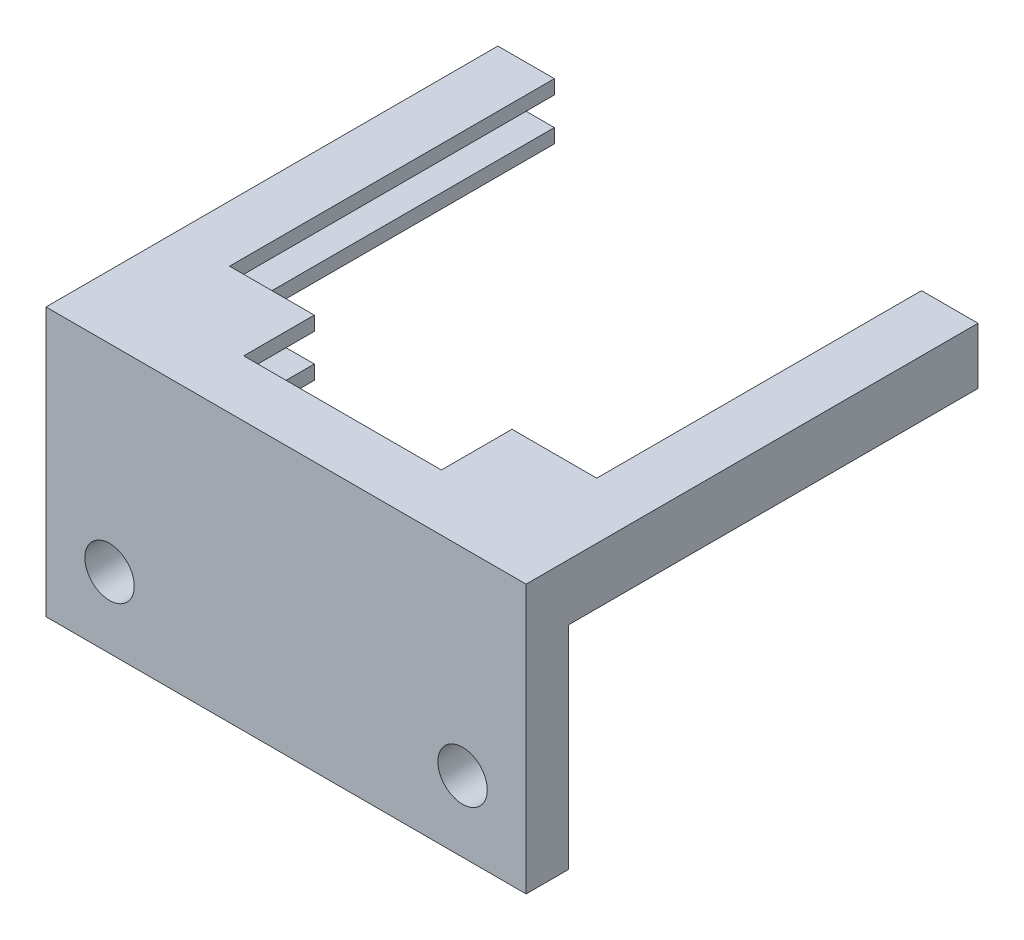
ISO-10303-21;
HEADER;
FILE_DESCRIPTION(('STEP AP214'),'2;1');
FILE_NAME('part.step','',(''),(''),'','','');
FILE_SCHEMA(('AUTOMOTIVE_DESIGN { 1 0 10303 214 1 1 1 1 }'));
ENDSEC;
DATA;
#1=APPLICATION_CONTEXT('core data for automotive mechanical design processes');
#2=APPLICATION_PROTOCOL_DEFINITION('international standard','automotive_design',2000,#1);
#3=PRODUCT_CONTEXT('',#1,'mechanical');
#4=PRODUCT('Part','Part','',(#3));
#5=PRODUCT_RELATED_PRODUCT_CATEGORY('part','',(#4));
#6=PRODUCT_DEFINITION_FORMATION('','',#4);
#7=PRODUCT_DEFINITION_CONTEXT('part definition',#1,'design');
#8=PRODUCT_DEFINITION('design','',#6,#7);
#9=PRODUCT_DEFINITION_SHAPE('','',#8);
#10=(LENGTH_UNIT() NAMED_UNIT(*) SI_UNIT(.MILLI.,.METRE.));
#11=(NAMED_UNIT(*) PLANE_ANGLE_UNIT() SI_UNIT($,.RADIAN.));
#12=(NAMED_UNIT(*) SI_UNIT($,.STERADIAN.) SOLID_ANGLE_UNIT());
#13=UNCERTAINTY_MEASURE_WITH_UNIT(LENGTH_MEASURE(1.E-05),#10,'distance_accuracy_value','');
#14=(GEOMETRIC_REPRESENTATION_CONTEXT(3) GLOBAL_UNCERTAINTY_ASSIGNED_CONTEXT((#13)) GLOBAL_UNIT_ASSIGNED_CONTEXT((#10,
#11,#12)) REPRESENTATION_CONTEXT('',''));
#15=CARTESIAN_POINT('',(0.,0.,0.));
#16=DIRECTION('',(0.,0.,1.));
#17=DIRECTION('',(1.,0.,0.));
#18=AXIS2_PLACEMENT_3D('',#15,#16,#17);
#19=CARTESIAN_POINT('',(4.,0.,-6.));
#20=DIRECTION('',(0.,0.,1.));
#21=DIRECTION('',(1.,0.,0.));
#22=AXIS2_PLACEMENT_3D('',#19,#20,#21);
#23=PLANE('',#22);
#24=DIRECTION('',(0.,-1.,0.));
#25=VECTOR('',#24,1.);
#26=CARTESIAN_POINT('',(10.,4.,-6.));
#27=LINE('',#26,#25);
#28=CARTESIAN_POINT('',(10.,0.999999999999998,-6.));
#29=VERTEX_POINT('',#28);
#30=CARTESIAN_POINT('',(10.,0.,-6.));
#31=VERTEX_POINT('',#30);
#32=EDGE_CURVE('E222',#29,#31,#27,.T.);
#33=ORIENTED_EDGE('',*,*,#32,.T.);
#34=DIRECTION('',(1.,0.,0.));
#35=VECTOR('',#34,1.);
#36=CARTESIAN_POINT('',(4.,0.,-6.));
#37=LINE('',#36,#35);
#38=CARTESIAN_POINT('',(4.,0.,-6.));
#39=VERTEX_POINT('',#38);
#40=EDGE_CURVE('E309',#39,#31,#37,.T.);
#41=ORIENTED_EDGE('',*,*,#40,.F.);
#42=DIRECTION('',(0.,1.,0.));
#43=VECTOR('',#42,1.);
#44=CARTESIAN_POINT('',(4.,0.,-6.));
#45=LINE('',#44,#43);
#46=CARTESIAN_POINT('',(4.,1.,-6.));
#47=VERTEX_POINT('',#46);
#48=EDGE_CURVE('E261',#39,#47,#45,.T.);
#49=ORIENTED_EDGE('',*,*,#48,.T.);
#50=DIRECTION('',(1.,0.,0.));
#51=VECTOR('',#50,1.);
#52=CARTESIAN_POINT('',(4.,1.,-6.));
#53=LINE('',#52,#51);
#54=EDGE_CURVE('E11',#47,#29,#53,.T.);
#55=ORIENTED_EDGE('',*,*,#54,.T.);
#56=EDGE_LOOP('',(#33,#41,#49,#55));
#57=FACE_BOUND('',#56,.T.);
#58=ADVANCED_FACE('F39',(#57),#23,.F.);
#59=CARTESIAN_POINT('',(0.,4.,0.));
#60=DIRECTION('',(0.,-1.,0.));
#61=DIRECTION('',(0.,0.,-1.));
#62=AXIS2_PLACEMENT_3D('',#59,#60,#61);
#63=PLANE('',#62);
#64=DIRECTION('',(0.,0.,-1.));
#65=VECTOR('',#64,1.);
#66=CARTESIAN_POINT('',(10.,4.,13.560219778561));
#67=LINE('',#66,#65);
#68=CARTESIAN_POINT('',(10.,4.,-1.));
#69=VERTEX_POINT('',#68);
#70=CARTESIAN_POINT('',(10.,4.,-6.));
#71=VERTEX_POINT('',#70);
#72=EDGE_CURVE('E214',#69,#71,#67,.T.);
#73=ORIENTED_EDGE('',*,*,#72,.T.);
#74=DIRECTION('',(1.,0.,0.));
#75=VECTOR('',#74,1.);
#76=CARTESIAN_POINT('',(4.,4.,-6.));
#77=LINE('',#76,#75);
#78=CARTESIAN_POINT('',(4.,4.,-6.));
#79=VERTEX_POINT('',#78);
#80=EDGE_CURVE('E228',#79,#71,#77,.T.);
#81=ORIENTED_EDGE('',*,*,#80,.F.);
#82=DIRECTION('',(0.,0.,1.));
#83=VECTOR('',#82,1.);
#84=CARTESIAN_POINT('',(4.,4.,-29.));
#85=LINE('',#84,#83);
#86=CARTESIAN_POINT('',(4.,4.,-29.));
#87=VERTEX_POINT('',#86);
#88=EDGE_CURVE('E244',#87,#79,#85,.T.);
#89=ORIENTED_EDGE('',*,*,#88,.F.);
#90=DIRECTION('',(-1.,0.,0.));
#91=VECTOR('',#90,1.);
#92=CARTESIAN_POINT('',(0.,4.,-29.));
#93=LINE('',#92,#91);
#94=CARTESIAN_POINT('',(0.,4.,-29.));
#95=VERTEX_POINT('',#94);
#96=EDGE_CURVE('E269',#87,#95,#93,.T.);
#97=ORIENTED_EDGE('',*,*,#96,.T.);
#98=DIRECTION('',(0.,0.,1.));
#99=VECTOR('',#98,1.);
#100=CARTESIAN_POINT('',(0.,4.,0.));
#101=LINE('',#100,#99);
#102=CARTESIAN_POINT('',(0.,4.,3.));
#103=VERTEX_POINT('',#102);
#104=EDGE_CURVE('E264',#95,#103,#101,.T.);
#105=ORIENTED_EDGE('',*,*,#104,.T.);
#106=DIRECTION('',(-1.,0.,0.));
#107=VECTOR('',#106,1.);
#108=CARTESIAN_POINT('',(53.2353840616714,4.,3.));
#109=LINE('',#108,#107);
#110=CARTESIAN_POINT('',(34.,4.,3.));
#111=VERTEX_POINT('',#110);
#112=EDGE_CURVE('E371',#111,#103,#109,.T.);
#113=ORIENTED_EDGE('',*,*,#112,.F.);
#114=DIRECTION('',(0.,0.,-1.));
#115=VECTOR('',#114,1.);
#116=CARTESIAN_POINT('',(34.,4.,0.));
#117=LINE('',#116,#115);
#118=CARTESIAN_POINT('',(34.,4.,-29.));
#119=VERTEX_POINT('',#118);
#120=EDGE_CURVE('E266',#111,#119,#117,.T.);
#121=ORIENTED_EDGE('',*,*,#120,.T.);
#122=CARTESIAN_POINT('',(30.,4.,-29.));
#123=VERTEX_POINT('',#122);
#124=EDGE_CURVE('E270',#119,#123,#93,.T.);
#125=ORIENTED_EDGE('',*,*,#124,.T.);
#126=DIRECTION('',(0.,0.,-1.));
#127=VECTOR('',#126,1.);
#128=CARTESIAN_POINT('',(30.,4.,-29.));
#129=LINE('',#128,#127);
#130=CARTESIAN_POINT('',(30.,4.,-6.));
#131=VERTEX_POINT('',#130);
#132=EDGE_CURVE('E238',#131,#123,#129,.T.);
#133=ORIENTED_EDGE('',*,*,#132,.F.);
#134=CARTESIAN_POINT('',(24.,4.,-6.));
#135=VERTEX_POINT('',#134);
#136=EDGE_CURVE('E239',#135,#131,#77,.T.);
#137=ORIENTED_EDGE('',*,*,#136,.F.);
#138=DIRECTION('',(0.,0.,-1.));
#139=VECTOR('',#138,1.);
#140=CARTESIAN_POINT('',(24.,4.,13.560219778561));
#141=LINE('',#140,#139);
#142=CARTESIAN_POINT('',(24.,4.,-1.));
#143=VERTEX_POINT('',#142);
#144=EDGE_CURVE('E411',#143,#135,#141,.T.);
#145=ORIENTED_EDGE('',*,*,#144,.F.);
#146=DIRECTION('',(1.,0.,0.));
#147=VECTOR('',#146,1.);
#148=CARTESIAN_POINT('',(24.,4.,-1.));
#149=LINE('',#148,#147);
#150=EDGE_CURVE('E230',#69,#143,#149,.T.);
#151=ORIENTED_EDGE('',*,*,#150,.F.);
#152=EDGE_LOOP('',(#73,#81,#89,#97,#105,#113,#121,#125,#133,#137,#145,#151));
#153=FACE_BOUND('',#152,.T.);
#154=ADVANCED_FACE('F226',(#153),#63,.F.);
#155=CARTESIAN_POINT('',(0.,0.,0.));
#156=DIRECTION('',(0.,-1.,0.));
#157=DIRECTION('',(0.,0.,-1.));
#158=AXIS2_PLACEMENT_3D('',#155,#156,#157);
#159=PLANE('',#158);
#160=ORIENTED_EDGE('',*,*,#40,.T.);
#161=DIRECTION('',(0.,0.,-1.));
#162=VECTOR('',#161,1.);
#163=CARTESIAN_POINT('',(10.,0.,13.560219778561));
#164=LINE('',#163,#162);
#165=CARTESIAN_POINT('',(10.,0.,-1.));
#166=VERTEX_POINT('',#165);
#167=EDGE_CURVE('E232',#166,#31,#164,.T.);
#168=ORIENTED_EDGE('',*,*,#167,.F.);
#169=DIRECTION('',(1.,0.,0.));
#170=VECTOR('',#169,1.);
#171=CARTESIAN_POINT('',(24.,0.,-1.));
#172=LINE('',#171,#170);
#173=CARTESIAN_POINT('',(24.,0.,-1.));
#174=VERTEX_POINT('',#173);
#175=EDGE_CURVE('E231',#166,#174,#172,.T.);
#176=ORIENTED_EDGE('',*,*,#175,.T.);
#177=DIRECTION('',(0.,0.,-1.));
#178=VECTOR('',#177,1.);
#179=CARTESIAN_POINT('',(24.,0.,13.560219778561));
#180=LINE('',#179,#178);
#181=CARTESIAN_POINT('',(24.,0.,-6.));
#182=VERTEX_POINT('',#181);
#183=EDGE_CURVE('E408',#174,#182,#180,.T.);
#184=ORIENTED_EDGE('',*,*,#183,.T.);
#185=CARTESIAN_POINT('',(30.,0.,-6.));
#186=VERTEX_POINT('',#185);
#187=EDGE_CURVE('E314',#182,#186,#37,.T.);
#188=ORIENTED_EDGE('',*,*,#187,.T.);
#189=DIRECTION('',(0.,0.,-1.));
#190=VECTOR('',#189,1.);
#191=CARTESIAN_POINT('',(30.,0.,-29.));
#192=LINE('',#191,#190);
#193=CARTESIAN_POINT('',(30.,0.,-29.));
#194=VERTEX_POINT('',#193);
#195=EDGE_CURVE('E307',#186,#194,#192,.T.);
#196=ORIENTED_EDGE('',*,*,#195,.T.);
#197=DIRECTION('',(-1.,0.,0.));
#198=VECTOR('',#197,1.);
#199=CARTESIAN_POINT('',(0.,0.,-29.));
#200=LINE('',#199,#198);
#201=CARTESIAN_POINT('',(34.,0.,-29.));
#202=VERTEX_POINT('',#201);
#203=EDGE_CURVE('E267',#202,#194,#200,.T.);
#204=ORIENTED_EDGE('',*,*,#203,.F.);
#205=DIRECTION('',(0.,0.,-1.));
#206=VECTOR('',#205,1.);
#207=CARTESIAN_POINT('',(34.,0.,0.));
#208=LINE('',#207,#206);
#209=CARTESIAN_POINT('',(34.,0.,0.));
#210=VERTEX_POINT('',#209);
#211=EDGE_CURVE('E279',#210,#202,#208,.T.);
#212=ORIENTED_EDGE('',*,*,#211,.F.);
#213=DIRECTION('',(1.,0.,0.));
#214=VECTOR('',#213,1.);
#215=CARTESIAN_POINT('',(0.,0.,0.));
#216=LINE('',#215,#214);
#217=CARTESIAN_POINT('',(0.,0.,0.));
#218=VERTEX_POINT('',#217);
#219=EDGE_CURVE('E276',#218,#210,#216,.T.);
#220=ORIENTED_EDGE('',*,*,#219,.F.);
#221=DIRECTION('',(0.,0.,1.));
#222=VECTOR('',#221,1.);
#223=CARTESIAN_POINT('',(0.,0.,0.));
#224=LINE('',#223,#222);
#225=CARTESIAN_POINT('',(0.,0.,-29.));
#226=VERTEX_POINT('',#225);
#227=EDGE_CURVE('E251',#226,#218,#224,.T.);
#228=ORIENTED_EDGE('',*,*,#227,.F.);
#229=CARTESIAN_POINT('',(4.,0.,-29.));
#230=VERTEX_POINT('',#229);
#231=EDGE_CURVE('E281',#230,#226,#200,.T.);
#232=ORIENTED_EDGE('',*,*,#231,.F.);
#233=DIRECTION('',(0.,0.,1.));
#234=VECTOR('',#233,1.);
#235=CARTESIAN_POINT('',(4.,0.,-29.));
#236=LINE('',#235,#234);
#237=EDGE_CURVE('E242',#230,#39,#236,.T.);
#238=ORIENTED_EDGE('',*,*,#237,.T.);
#239=EDGE_LOOP('',(#160,#168,#176,#184,#188,#196,#204,#212,#220,#228,#232,#238));
#240=FACE_BOUND('',#239,.T.);
#241=ADVANCED_FACE('F481',(#240),#159,.T.);
#242=CARTESIAN_POINT('',(10.,3.,-6.));
#243=VERTEX_POINT('',#242);
#244=EDGE_CURVE('E211',#71,#243,#27,.T.);
#245=ORIENTED_EDGE('',*,*,#244,.T.);
#246=DIRECTION('',(-1.,0.,0.));
#247=VECTOR('',#246,1.);
#248=CARTESIAN_POINT('',(4.,3.,-6.));
#249=LINE('',#248,#247);
#250=CARTESIAN_POINT('',(4.,3.,-6.));
#251=VERTEX_POINT('',#250);
#252=EDGE_CURVE('E288',#243,#251,#249,.T.);
#253=ORIENTED_EDGE('',*,*,#252,.T.);
#254=EDGE_CURVE('E236',#251,#79,#45,.T.);
#255=ORIENTED_EDGE('',*,*,#254,.T.);
#256=ORIENTED_EDGE('',*,*,#80,.T.);
#257=EDGE_LOOP('',(#245,#253,#255,#256));
#258=FACE_BOUND('',#257,.T.);
#259=ADVANCED_FACE('F234',(#258),#23,.F.);
#260=CARTESIAN_POINT('',(1.,1.,-1.));
#261=DIRECTION('',(0.,-1.,0.));
#262=DIRECTION('',(1.,0.,0.));
#263=AXIS2_PLACEMENT_3D('',#260,#261,#262);
#264=PLANE('',#263);
#265=DIRECTION('',(0.,0.,1.));
#266=VECTOR('',#265,1.);
#267=CARTESIAN_POINT('',(10.,0.999999999999999,-1.));
#268=LINE('',#267,#266);
#269=CARTESIAN_POINT('',(10.,0.999999999999999,-1.));
#270=VERTEX_POINT('',#269);
#271=EDGE_CURVE('E389',#29,#270,#268,.T.);
#272=ORIENTED_EDGE('',*,*,#271,.F.);
#273=ORIENTED_EDGE('',*,*,#54,.F.);
#274=DIRECTION('',(0.,0.,1.));
#275=VECTOR('',#274,1.);
#276=CARTESIAN_POINT('',(4.,1.,-29.));
#277=LINE('',#276,#275);
#278=CARTESIAN_POINT('',(4.,1.,-29.));
#279=VERTEX_POINT('',#278);
#280=EDGE_CURVE('E319',#279,#47,#277,.T.);
#281=ORIENTED_EDGE('',*,*,#280,.F.);
#282=DIRECTION('',(-1.,0.,0.));
#283=VECTOR('',#282,1.);
#284=CARTESIAN_POINT('',(1.,1.,-29.));
#285=LINE('',#284,#283);
#286=CARTESIAN_POINT('',(1.,1.,-29.));
#287=VERTEX_POINT('',#286);
#288=EDGE_CURVE('E340',#279,#287,#285,.T.);
#289=ORIENTED_EDGE('',*,*,#288,.T.);
#290=DIRECTION('',(0.,0.,-1.));
#291=VECTOR('',#290,1.);
#292=CARTESIAN_POINT('',(1.,1.,-1.));
#293=LINE('',#292,#291);
#294=CARTESIAN_POINT('',(1.,1.,-1.));
#295=VERTEX_POINT('',#294);
#296=EDGE_CURVE('E326',#295,#287,#293,.T.);
#297=ORIENTED_EDGE('',*,*,#296,.F.);
#298=DIRECTION('',(-1.,0.,0.));
#299=VECTOR('',#298,1.);
#300=CARTESIAN_POINT('',(1.,1.,-1.));
#301=LINE('',#300,#299);
#302=EDGE_CURVE('E352',#270,#295,#301,.T.);
#303=ORIENTED_EDGE('',*,*,#302,.F.);
#304=EDGE_LOOP('',(#272,#273,#281,#289,#297,#303));
#305=FACE_BOUND('',#304,.T.);
#306=ADVANCED_FACE('F517',(#305),#264,.F.);
#307=CARTESIAN_POINT('',(1.,3.,-1.));
#308=DIRECTION('',(0.,1.,0.));
#309=DIRECTION('',(-1.,0.,0.));
#310=AXIS2_PLACEMENT_3D('',#307,#308,#309);
#311=PLANE('',#310);
#312=DIRECTION('',(0.,0.,-1.));
#313=VECTOR('',#312,1.);
#314=CARTESIAN_POINT('',(10.,3.,-1.));
#315=LINE('',#314,#313);
#316=CARTESIAN_POINT('',(10.,3.,-1.));
#317=VERTEX_POINT('',#316);
#318=EDGE_CURVE('E217',#317,#243,#315,.T.);
#319=ORIENTED_EDGE('',*,*,#318,.F.);
#320=DIRECTION('',(1.,0.,0.));
#321=VECTOR('',#320,1.);
#322=CARTESIAN_POINT('',(1.,3.,-1.));
#323=LINE('',#322,#321);
#324=CARTESIAN_POINT('',(1.,3.,-1.));
#325=VERTEX_POINT('',#324);
#326=EDGE_CURVE('E356',#325,#317,#323,.T.);
#327=ORIENTED_EDGE('',*,*,#326,.F.);
#328=DIRECTION('',(0.,0.,-1.));
#329=VECTOR('',#328,1.);
#330=CARTESIAN_POINT('',(1.,3.,-1.));
#331=LINE('',#330,#329);
#332=CARTESIAN_POINT('',(1.,3.,-29.));
#333=VERTEX_POINT('',#332);
#334=EDGE_CURVE('E327',#325,#333,#331,.T.);
#335=ORIENTED_EDGE('',*,*,#334,.T.);
#336=DIRECTION('',(1.,0.,0.));
#337=VECTOR('',#336,1.);
#338=CARTESIAN_POINT('',(1.,3.,-29.));
#339=LINE('',#338,#337);
#340=CARTESIAN_POINT('',(4.,3.,-29.));
#341=VERTEX_POINT('',#340);
#342=EDGE_CURVE('E300',#333,#341,#339,.T.);
#343=ORIENTED_EDGE('',*,*,#342,.T.);
#344=DIRECTION('',(0.,0.,-1.));
#345=VECTOR('',#344,1.);
#346=CARTESIAN_POINT('',(4.,3.,-29.));
#347=LINE('',#346,#345);
#348=EDGE_CURVE('E297',#251,#341,#347,.T.);
#349=ORIENTED_EDGE('',*,*,#348,.F.);
#350=ORIENTED_EDGE('',*,*,#252,.F.);
#351=EDGE_LOOP('',(#319,#327,#335,#343,#349,#350));
#352=FACE_BOUND('',#351,.T.);
#353=ADVANCED_FACE('F298',(#352),#311,.F.);
#354=CARTESIAN_POINT('',(4.,0.,-29.));
#355=DIRECTION('',(-1.,0.,0.));
#356=DIRECTION('',(0.,0.,1.));
#357=AXIS2_PLACEMENT_3D('',#354,#355,#356);
#358=PLANE('',#357);
#359=DIRECTION('',(0.,1.,0.));
#360=VECTOR('',#359,1.);
#361=CARTESIAN_POINT('',(4.,0.,-29.));
#362=LINE('',#361,#360);
#363=EDGE_CURVE('E248',#230,#279,#362,.T.);
#364=ORIENTED_EDGE('',*,*,#363,.T.);
#365=ORIENTED_EDGE('',*,*,#280,.T.);
#366=ORIENTED_EDGE('',*,*,#48,.F.);
#367=ORIENTED_EDGE('',*,*,#237,.F.);
#368=EDGE_LOOP('',(#364,#365,#366,#367));
#369=FACE_BOUND('',#368,.T.);
#370=ADVANCED_FACE('F531',(#369),#358,.F.);
#371=CARTESIAN_POINT('',(30.,0.,-29.));
#372=DIRECTION('',(1.,0.,0.));
#373=DIRECTION('',(0.,0.,-1.));
#374=AXIS2_PLACEMENT_3D('',#371,#372,#373);
#375=PLANE('',#374);
#376=DIRECTION('',(0.,1.,0.));
#377=VECTOR('',#376,1.);
#378=CARTESIAN_POINT('',(30.,0.,-6.));
#379=LINE('',#378,#377);
#380=CARTESIAN_POINT('',(30.,0.999999999999996,-6.));
#381=VERTEX_POINT('',#380);
#382=EDGE_CURVE('E257',#186,#381,#379,.T.);
#383=ORIENTED_EDGE('',*,*,#382,.T.);
#384=DIRECTION('',(0.,0.,-1.));
#385=VECTOR('',#384,1.);
#386=CARTESIAN_POINT('',(30.,0.999999999999997,-29.));
#387=LINE('',#386,#385);
#388=CARTESIAN_POINT('',(30.,0.999999999999997,-29.));
#389=VERTEX_POINT('',#388);
#390=EDGE_CURVE('E303',#381,#389,#387,.T.);
#391=ORIENTED_EDGE('',*,*,#390,.T.);
#392=DIRECTION('',(0.,1.,0.));
#393=VECTOR('',#392,1.);
#394=CARTESIAN_POINT('',(30.,0.,-29.));
#395=LINE('',#394,#393);
#396=EDGE_CURVE('E253',#194,#389,#395,.T.);
#397=ORIENTED_EDGE('',*,*,#396,.F.);
#398=ORIENTED_EDGE('',*,*,#195,.F.);
#399=EDGE_LOOP('',(#383,#391,#397,#398));
#400=FACE_BOUND('',#399,.T.);
#401=ADVANCED_FACE('F483',(#400),#375,.F.);
#402=ORIENTED_EDGE('',*,*,#187,.F.);
#403=DIRECTION('',(0.,-1.,0.));
#404=VECTOR('',#403,1.);
#405=CARTESIAN_POINT('',(24.,4.,-6.));
#406=LINE('',#405,#404);
#407=CARTESIAN_POINT('',(24.,0.999999999999998,-6.));
#408=VERTEX_POINT('',#407);
#409=EDGE_CURVE('E221',#408,#182,#406,.T.);
#410=ORIENTED_EDGE('',*,*,#409,.F.);
#411=EDGE_CURVE('E47',#408,#381,#53,.T.);
#412=ORIENTED_EDGE('',*,*,#411,.T.);
#413=ORIENTED_EDGE('',*,*,#382,.F.);
#414=EDGE_LOOP('',(#402,#410,#412,#413));
#415=FACE_BOUND('',#414,.T.);
#416=ADVANCED_FACE('F479',(#415),#23,.F.);
#417=CARTESIAN_POINT('',(0.,4.,-29.));
#418=DIRECTION('',(0.,0.,1.));
#419=DIRECTION('',(1.,0.,0.));
#420=AXIS2_PLACEMENT_3D('',#417,#418,#419);
#421=PLANE('',#420);
#422=DIRECTION('',(0.,1.,0.));
#423=VECTOR('',#422,1.);
#424=CARTESIAN_POINT('',(1.,1.,-29.));
#425=LINE('',#424,#423);
#426=EDGE_CURVE('E346',#287,#333,#425,.T.);
#427=ORIENTED_EDGE('',*,*,#426,.F.);
#428=ORIENTED_EDGE('',*,*,#288,.F.);
#429=ORIENTED_EDGE('',*,*,#363,.F.);
#430=ORIENTED_EDGE('',*,*,#231,.T.);
#431=DIRECTION('',(0.,-1.,0.));
#432=VECTOR('',#431,1.);
#433=CARTESIAN_POINT('',(0.,4.,-29.));
#434=LINE('',#433,#432);
#435=EDGE_CURVE('E273',#95,#226,#434,.T.);
#436=ORIENTED_EDGE('',*,*,#435,.F.);
#437=ORIENTED_EDGE('',*,*,#96,.F.);
#438=EDGE_CURVE('E252',#341,#87,#362,.T.);
#439=ORIENTED_EDGE('',*,*,#438,.F.);
#440=ORIENTED_EDGE('',*,*,#342,.F.);
#441=EDGE_LOOP('',(#427,#428,#429,#430,#436,#437,#439,#440));
#442=FACE_BOUND('',#441,.T.);
#443=ADVANCED_FACE('F430',(#442),#421,.F.);
#444=CARTESIAN_POINT('',(0.,4.,0.));
#445=DIRECTION('',(1.,0.,0.));
#446=DIRECTION('',(0.,0.,-1.));
#447=AXIS2_PLACEMENT_3D('',#444,#445,#446);
#448=PLANE('',#447);
#449=ORIENTED_EDGE('',*,*,#227,.T.);
#450=DIRECTION('',(0.,-1.,0.));
#451=VECTOR('',#450,1.);
#452=CARTESIAN_POINT('',(0.,-15.,0.));
#453=LINE('',#452,#451);
#454=CARTESIAN_POINT('',(0.,-15.,0.));
#455=VERTEX_POINT('',#454);
#456=EDGE_CURVE('E380',#218,#455,#453,.T.);
#457=ORIENTED_EDGE('',*,*,#456,.T.);
#458=DIRECTION('',(0.,0.,1.));
#459=VECTOR('',#458,1.);
#460=CARTESIAN_POINT('',(0.,-15.,2.99999999999994));
#461=LINE('',#460,#459);
#462=CARTESIAN_POINT('',(0.,-15.,2.99999999999994));
#463=VERTEX_POINT('',#462);
#464=EDGE_CURVE('E377',#455,#463,#461,.T.);
#465=ORIENTED_EDGE('',*,*,#464,.T.);
#466=DIRECTION('',(0.,1.,0.));
#467=VECTOR('',#466,1.);
#468=CARTESIAN_POINT('',(0.,4.,3.));
#469=LINE('',#468,#467);
#470=EDGE_CURVE('E369',#463,#103,#469,.T.);
#471=ORIENTED_EDGE('',*,*,#470,.T.);
#472=ORIENTED_EDGE('',*,*,#104,.F.);
#473=ORIENTED_EDGE('',*,*,#435,.T.);
#474=EDGE_LOOP('',(#449,#457,#465,#471,#472,#473));
#475=FACE_BOUND('',#474,.T.);
#476=ADVANCED_FACE('F41',(#475),#448,.F.);
#477=CARTESIAN_POINT('',(34.,4.,0.));
#478=DIRECTION('',(-1.,0.,0.));
#479=DIRECTION('',(0.,0.,1.));
#480=AXIS2_PLACEMENT_3D('',#477,#478,#479);
#481=PLANE('',#480);
#482=ORIENTED_EDGE('',*,*,#211,.T.);
#483=DIRECTION('',(0.,-1.,0.));
#484=VECTOR('',#483,1.);
#485=CARTESIAN_POINT('',(34.,4.,-29.));
#486=LINE('',#485,#484);
#487=EDGE_CURVE('E286',#119,#202,#486,.T.);
#488=ORIENTED_EDGE('',*,*,#487,.F.);
#489=ORIENTED_EDGE('',*,*,#120,.F.);
#490=DIRECTION('',(0.,-1.,0.));
#491=VECTOR('',#490,1.);
#492=CARTESIAN_POINT('',(34.,4.,3.));
#493=LINE('',#492,#491);
#494=CARTESIAN_POINT('',(34.,-15.,2.99999999999994));
#495=VERTEX_POINT('',#494);
#496=EDGE_CURVE('E364',#111,#495,#493,.T.);
#497=ORIENTED_EDGE('',*,*,#496,.T.);
#498=DIRECTION('',(0.,0.,-1.));
#499=VECTOR('',#498,1.);
#500=CARTESIAN_POINT('',(34.,-15.,2.99999999999994));
#501=LINE('',#500,#499);
#502=CARTESIAN_POINT('',(34.,-15.,0.));
#503=VERTEX_POINT('',#502);
#504=EDGE_CURVE('E374',#495,#503,#501,.T.);
#505=ORIENTED_EDGE('',*,*,#504,.T.);
#506=DIRECTION('',(0.,1.,0.));
#507=VECTOR('',#506,1.);
#508=CARTESIAN_POINT('',(34.,-15.,0.));
#509=LINE('',#508,#507);
#510=EDGE_CURVE('E349',#503,#210,#509,.T.);
#511=ORIENTED_EDGE('',*,*,#510,.T.);
#512=EDGE_LOOP('',(#482,#488,#489,#497,#505,#511));
#513=FACE_BOUND('',#512,.T.);
#514=ADVANCED_FACE('F449',(#513),#481,.F.);
#515=ORIENTED_EDGE('',*,*,#396,.T.);
#516=CARTESIAN_POINT('',(33.,0.999999999999996,-29.));
#517=VERTEX_POINT('',#516);
#518=EDGE_CURVE('E337',#517,#389,#285,.T.);
#519=ORIENTED_EDGE('',*,*,#518,.F.);
#520=DIRECTION('',(0.,-1.,0.));
#521=VECTOR('',#520,1.);
#522=CARTESIAN_POINT('',(33.,0.999999999999996,-29.));
#523=LINE('',#522,#521);
#524=CARTESIAN_POINT('',(33.,3.,-29.));
#525=VERTEX_POINT('',#524);
#526=EDGE_CURVE('E341',#525,#517,#523,.T.);
#527=ORIENTED_EDGE('',*,*,#526,.F.);
#528=CARTESIAN_POINT('',(30.,3.,-29.));
#529=VERTEX_POINT('',#528);
#530=EDGE_CURVE('E345',#529,#525,#339,.T.);
#531=ORIENTED_EDGE('',*,*,#530,.F.);
#532=EDGE_CURVE('E256',#529,#123,#395,.T.);
#533=ORIENTED_EDGE('',*,*,#532,.T.);
#534=ORIENTED_EDGE('',*,*,#124,.F.);
#535=ORIENTED_EDGE('',*,*,#487,.T.);
#536=ORIENTED_EDGE('',*,*,#203,.T.);
#537=EDGE_LOOP('',(#515,#519,#527,#531,#533,#534,#535,#536));
#538=FACE_BOUND('',#537,.T.);
#539=ADVANCED_FACE('F451',(#538),#421,.F.);
#540=ORIENTED_EDGE('',*,*,#254,.F.);
#541=ORIENTED_EDGE('',*,*,#348,.T.);
#542=ORIENTED_EDGE('',*,*,#438,.T.);
#543=ORIENTED_EDGE('',*,*,#88,.T.);
#544=EDGE_LOOP('',(#540,#541,#542,#543));
#545=FACE_BOUND('',#544,.T.);
#546=ADVANCED_FACE('F306',(#545),#358,.F.);
#547=ORIENTED_EDGE('',*,*,#532,.F.);
#548=DIRECTION('',(0.,0.,1.));
#549=VECTOR('',#548,1.);
#550=CARTESIAN_POINT('',(30.,3.,-29.));
#551=LINE('',#550,#549);
#552=CARTESIAN_POINT('',(30.,3.,-6.));
#553=VERTEX_POINT('',#552);
#554=EDGE_CURVE('E304',#529,#553,#551,.T.);
#555=ORIENTED_EDGE('',*,*,#554,.T.);
#556=EDGE_CURVE('E260',#553,#131,#379,.T.);
#557=ORIENTED_EDGE('',*,*,#556,.T.);
#558=ORIENTED_EDGE('',*,*,#132,.T.);
#559=EDGE_LOOP('',(#547,#555,#557,#558));
#560=FACE_BOUND('',#559,.T.);
#561=ADVANCED_FACE('F457',(#560),#375,.F.);
#562=CARTESIAN_POINT('',(24.,3.,-6.));
#563=VERTEX_POINT('',#562);
#564=EDGE_CURVE('E289',#553,#563,#249,.T.);
#565=ORIENTED_EDGE('',*,*,#564,.T.);
#566=EDGE_CURVE('E413',#135,#563,#406,.T.);
#567=ORIENTED_EDGE('',*,*,#566,.F.);
#568=ORIENTED_EDGE('',*,*,#136,.T.);
#569=ORIENTED_EDGE('',*,*,#556,.F.);
#570=EDGE_LOOP('',(#565,#567,#568,#569));
#571=FACE_BOUND('',#570,.T.);
#572=ADVANCED_FACE('F459',(#571),#23,.F.);
#573=ORIENTED_EDGE('',*,*,#411,.F.);
#574=DIRECTION('',(0.,0.,1.));
#575=VECTOR('',#574,1.);
#576=CARTESIAN_POINT('',(24.,0.999999999999997,-1.));
#577=LINE('',#576,#575);
#578=CARTESIAN_POINT('',(24.,0.999999999999996,-1.));
#579=VERTEX_POINT('',#578);
#580=EDGE_CURVE('E399',#408,#579,#577,.T.);
#581=ORIENTED_EDGE('',*,*,#580,.T.);
#582=CARTESIAN_POINT('',(33.,0.999999999999996,-1.));
#583=VERTEX_POINT('',#582);
#584=EDGE_CURVE('E330',#583,#579,#301,.T.);
#585=ORIENTED_EDGE('',*,*,#584,.F.);
#586=DIRECTION('',(0.,0.,-1.));
#587=VECTOR('',#586,1.);
#588=CARTESIAN_POINT('',(33.,0.999999999999996,-1.));
#589=LINE('',#588,#587);
#590=EDGE_CURVE('E333',#583,#517,#589,.T.);
#591=ORIENTED_EDGE('',*,*,#590,.T.);
#592=ORIENTED_EDGE('',*,*,#518,.T.);
#593=ORIENTED_EDGE('',*,*,#390,.F.);
#594=EDGE_LOOP('',(#573,#581,#585,#591,#592,#593));
#595=FACE_BOUND('',#594,.T.);
#596=ADVANCED_FACE('F472',(#595),#264,.F.);
#597=CARTESIAN_POINT('',(24.,3.,-1.));
#598=VERTEX_POINT('',#597);
#599=CARTESIAN_POINT('',(33.,3.,-1.));
#600=VERTEX_POINT('',#599);
#601=EDGE_CURVE('E359',#598,#600,#323,.T.);
#602=ORIENTED_EDGE('',*,*,#601,.F.);
#603=DIRECTION('',(0.,0.,-1.));
#604=VECTOR('',#603,1.);
#605=CARTESIAN_POINT('',(24.,3.,-1.));
#606=LINE('',#605,#604);
#607=EDGE_CURVE('E402',#598,#563,#606,.T.);
#608=ORIENTED_EDGE('',*,*,#607,.T.);
#609=ORIENTED_EDGE('',*,*,#564,.F.);
#610=ORIENTED_EDGE('',*,*,#554,.F.);
#611=ORIENTED_EDGE('',*,*,#530,.T.);
#612=DIRECTION('',(0.,0.,-1.));
#613=VECTOR('',#612,1.);
#614=CARTESIAN_POINT('',(33.,3.,-1.));
#615=LINE('',#614,#613);
#616=EDGE_CURVE('E329',#600,#525,#615,.T.);
#617=ORIENTED_EDGE('',*,*,#616,.F.);
#618=EDGE_LOOP('',(#602,#608,#609,#610,#611,#617));
#619=FACE_BOUND('',#618,.T.);
#620=ADVANCED_FACE('F464',(#619),#311,.F.);
#621=CARTESIAN_POINT('',(1.,1.,-1.));
#622=DIRECTION('',(-1.,0.,0.));
#623=DIRECTION('',(0.,0.,1.));
#624=AXIS2_PLACEMENT_3D('',#621,#622,#623);
#625=PLANE('',#624);
#626=ORIENTED_EDGE('',*,*,#426,.T.);
#627=ORIENTED_EDGE('',*,*,#334,.F.);
#628=DIRECTION('',(0.,1.,0.));
#629=VECTOR('',#628,1.);
#630=CARTESIAN_POINT('',(1.,1.,-1.));
#631=LINE('',#630,#629);
#632=EDGE_CURVE('E339',#295,#325,#631,.T.);
#633=ORIENTED_EDGE('',*,*,#632,.F.);
#634=ORIENTED_EDGE('',*,*,#296,.T.);
#635=EDGE_LOOP('',(#626,#627,#633,#634));
#636=FACE_BOUND('',#635,.T.);
#637=ADVANCED_FACE('F426',(#636),#625,.F.);
#638=CARTESIAN_POINT('',(33.,0.999999999999996,-1.));
#639=DIRECTION('',(1.,0.,0.));
#640=DIRECTION('',(0.,0.,-1.));
#641=AXIS2_PLACEMENT_3D('',#638,#639,#640);
#642=PLANE('',#641);
#643=ORIENTED_EDGE('',*,*,#526,.T.);
#644=ORIENTED_EDGE('',*,*,#590,.F.);
#645=DIRECTION('',(0.,-1.,0.));
#646=VECTOR('',#645,1.);
#647=CARTESIAN_POINT('',(33.,0.999999999999996,-1.));
#648=LINE('',#647,#646);
#649=EDGE_CURVE('E353',#600,#583,#648,.T.);
#650=ORIENTED_EDGE('',*,*,#649,.F.);
#651=ORIENTED_EDGE('',*,*,#616,.T.);
#652=EDGE_LOOP('',(#643,#644,#650,#651));
#653=FACE_BOUND('',#652,.T.);
#654=ADVANCED_FACE('F539',(#653),#642,.F.);
#655=CARTESIAN_POINT('',(0.,0.,-1.));
#656=DIRECTION('',(0.,0.,-1.));
#657=DIRECTION('',(-1.,0.,0.));
#658=AXIS2_PLACEMENT_3D('',#655,#656,#657);
#659=PLANE('',#658);
#660=ORIENTED_EDGE('',*,*,#584,.T.);
#661=DIRECTION('',(0.,1.,0.));
#662=VECTOR('',#661,1.);
#663=CARTESIAN_POINT('',(24.,4.,-1.));
#664=LINE('',#663,#662);
#665=EDGE_CURVE('E405',#174,#579,#664,.T.);
#666=ORIENTED_EDGE('',*,*,#665,.F.);
#667=ORIENTED_EDGE('',*,*,#175,.F.);
#668=DIRECTION('',(0.,1.,0.));
#669=VECTOR('',#668,1.);
#670=CARTESIAN_POINT('',(10.,4.,-1.));
#671=LINE('',#670,#669);
#672=EDGE_CURVE('E54',#166,#270,#671,.T.);
#673=ORIENTED_EDGE('',*,*,#672,.T.);
#674=ORIENTED_EDGE('',*,*,#302,.T.);
#675=ORIENTED_EDGE('',*,*,#632,.T.);
#676=ORIENTED_EDGE('',*,*,#326,.T.);
#677=EDGE_CURVE('E417',#317,#69,#671,.T.);
#678=ORIENTED_EDGE('',*,*,#677,.T.);
#679=ORIENTED_EDGE('',*,*,#150,.T.);
#680=EDGE_CURVE('E61',#598,#143,#664,.T.);
#681=ORIENTED_EDGE('',*,*,#680,.F.);
#682=ORIENTED_EDGE('',*,*,#601,.T.);
#683=ORIENTED_EDGE('',*,*,#649,.T.);
#684=EDGE_LOOP('',(#660,#666,#667,#673,#674,#675,#676,#678,#679,#681,#682,#683));
#685=FACE_BOUND('',#684,.T.);
#686=ADVANCED_FACE('F420',(#685),#659,.T.);
#687=CARTESIAN_POINT('',(53.2353840616714,4.,3.));
#688=DIRECTION('',(0.,0.,1.));
#689=DIRECTION('',(0.,-1.,0.));
#690=AXIS2_PLACEMENT_3D('',#687,#688,#689);
#691=PLANE('',#690);
#692=CARTESIAN_POINT('',(29.5,-10.,3.00000000000002));
#693=DIRECTION('',(0.,0.,-1.));
#694=DIRECTION('',(0.,1.,0.));
#695=AXIS2_PLACEMENT_3D('',#692,#693,#694);
#696=CIRCLE('',#695,1.75);
#697=CARTESIAN_POINT('',(29.5,-8.25000000000001,3.00000000000002));
#698=VERTEX_POINT('',#697);
#699=EDGE_CURVE('E382',#698,#698,#696,.T.);
#700=ORIENTED_EDGE('',*,*,#699,.T.);
#701=EDGE_LOOP('',(#700));
#702=FACE_BOUND('',#701,.T.);
#703=CARTESIAN_POINT('',(4.5,-10.,3.00000000000002));
#704=DIRECTION('',(0.,0.,-1.));
#705=DIRECTION('',(0.,1.,0.));
#706=AXIS2_PLACEMENT_3D('',#703,#704,#705);
#707=CIRCLE('',#706,1.75);
#708=CARTESIAN_POINT('',(4.5,-8.25000000000001,3.00000000000002));
#709=VERTEX_POINT('',#708);
#710=EDGE_CURVE('E385',#709,#709,#707,.T.);
#711=ORIENTED_EDGE('',*,*,#710,.T.);
#712=EDGE_LOOP('',(#711));
#713=FACE_BOUND('',#712,.T.);
#714=ORIENTED_EDGE('',*,*,#496,.F.);
#715=ORIENTED_EDGE('',*,*,#112,.T.);
#716=ORIENTED_EDGE('',*,*,#470,.F.);
#717=DIRECTION('',(-1.,0.,0.));
#718=VECTOR('',#717,1.);
#719=CARTESIAN_POINT('',(53.2353840616714,-15.,2.99999999999994));
#720=LINE('',#719,#718);
#721=EDGE_CURVE('E368',#495,#463,#720,.T.);
#722=ORIENTED_EDGE('',*,*,#721,.F.);
#723=EDGE_LOOP('',(#714,#715,#716,#722));
#724=FACE_BOUND('',#723,.T.);
#725=ADVANCED_FACE('F444',(#702,#713,#724),#691,.T.);
#726=CARTESIAN_POINT('',(53.2353840616714,-15.,2.99999999999994));
#727=DIRECTION('',(0.,-1.,0.));
#728=DIRECTION('',(0.,0.,-1.));
#729=AXIS2_PLACEMENT_3D('',#726,#727,#728);
#730=PLANE('',#729);
#731=ORIENTED_EDGE('',*,*,#504,.F.);
#732=ORIENTED_EDGE('',*,*,#721,.T.);
#733=ORIENTED_EDGE('',*,*,#464,.F.);
#734=DIRECTION('',(-1.,0.,0.));
#735=VECTOR('',#734,1.);
#736=CARTESIAN_POINT('',(53.2353840616714,-15.,0.));
#737=LINE('',#736,#735);
#738=EDGE_CURVE('E365',#503,#455,#737,.T.);
#739=ORIENTED_EDGE('',*,*,#738,.F.);
#740=EDGE_LOOP('',(#731,#732,#733,#739));
#741=FACE_BOUND('',#740,.T.);
#742=ADVANCED_FACE('F492',(#741),#730,.T.);
#743=CARTESIAN_POINT('',(53.2353840616714,-15.,0.));
#744=DIRECTION('',(0.,0.,-1.));
#745=DIRECTION('',(0.,1.,0.));
#746=AXIS2_PLACEMENT_3D('',#743,#744,#745);
#747=PLANE('',#746);
#748=CARTESIAN_POINT('',(29.5,-10.,0.));
#749=DIRECTION('',(0.,0.,-1.));
#750=DIRECTION('',(0.,1.,0.));
#751=AXIS2_PLACEMENT_3D('',#748,#749,#750);
#752=CIRCLE('',#751,1.75);
#753=CARTESIAN_POINT('',(29.5,-8.25,0.));
#754=VERTEX_POINT('',#753);
#755=EDGE_CURVE('E392',#754,#754,#752,.T.);
#756=ORIENTED_EDGE('',*,*,#755,.F.);
#757=EDGE_LOOP('',(#756));
#758=FACE_BOUND('',#757,.T.);
#759=CARTESIAN_POINT('',(4.5,-10.,0.));
#760=DIRECTION('',(0.,0.,-1.));
#761=DIRECTION('',(0.,1.,0.));
#762=AXIS2_PLACEMENT_3D('',#759,#760,#761);
#763=CIRCLE('',#762,1.75);
#764=CARTESIAN_POINT('',(4.5,-8.25,0.));
#765=VERTEX_POINT('',#764);
#766=EDGE_CURVE('E388',#765,#765,#763,.T.);
#767=ORIENTED_EDGE('',*,*,#766,.F.);
#768=EDGE_LOOP('',(#767));
#769=FACE_BOUND('',#768,.T.);
#770=ORIENTED_EDGE('',*,*,#456,.F.);
#771=ORIENTED_EDGE('',*,*,#219,.T.);
#772=ORIENTED_EDGE('',*,*,#510,.F.);
#773=ORIENTED_EDGE('',*,*,#738,.T.);
#774=EDGE_LOOP('',(#770,#771,#772,#773));
#775=FACE_BOUND('',#774,.T.);
#776=ADVANCED_FACE('F488',(#758,#769,#775),#747,.T.);
#777=CARTESIAN_POINT('',(4.5,-10.,3.00000000000002));
#778=DIRECTION('',(0.,0.,-1.));
#779=DIRECTION('',(0.,1.,0.));
#780=AXIS2_PLACEMENT_3D('',#777,#778,#779);
#781=CYLINDRICAL_SURFACE('',#780,1.75);
#782=ORIENTED_EDGE('',*,*,#710,.F.);
#783=EDGE_LOOP('',(#782));
#784=FACE_BOUND('',#783,.T.);
#785=ORIENTED_EDGE('',*,*,#766,.T.);
#786=EDGE_LOOP('',(#785));
#787=FACE_BOUND('',#786,.T.);
#788=ADVANCED_FACE('F500',(#784,#787),#781,.F.);
#789=CARTESIAN_POINT('',(29.5,-10.,3.00000000000002));
#790=DIRECTION('',(0.,0.,-1.));
#791=DIRECTION('',(0.,1.,0.));
#792=AXIS2_PLACEMENT_3D('',#789,#790,#791);
#793=CYLINDRICAL_SURFACE('',#792,1.75);
#794=ORIENTED_EDGE('',*,*,#699,.F.);
#795=EDGE_LOOP('',(#794));
#796=FACE_BOUND('',#795,.T.);
#797=ORIENTED_EDGE('',*,*,#755,.T.);
#798=EDGE_LOOP('',(#797));
#799=FACE_BOUND('',#798,.T.);
#800=ADVANCED_FACE('F557',(#796,#799),#793,.F.);
#801=CARTESIAN_POINT('',(24.,4.,13.560219778561));
#802=DIRECTION('',(1.,0.,0.));
#803=DIRECTION('',(0.,0.,-1.));
#804=AXIS2_PLACEMENT_3D('',#801,#802,#803);
#805=PLANE('',#804);
#806=ORIENTED_EDGE('',*,*,#680,.T.);
#807=ORIENTED_EDGE('',*,*,#144,.T.);
#808=ORIENTED_EDGE('',*,*,#566,.T.);
#809=ORIENTED_EDGE('',*,*,#607,.F.);
#810=EDGE_LOOP('',(#806,#807,#808,#809));
#811=FACE_BOUND('',#810,.T.);
#812=ADVANCED_FACE('F461',(#811),#805,.F.);
#813=CARTESIAN_POINT('',(10.,4.,13.560219778561));
#814=DIRECTION('',(1.,0.,0.));
#815=DIRECTION('',(0.,1.,0.));
#816=AXIS2_PLACEMENT_3D('',#813,#814,#815);
#817=PLANE('',#816);
#818=ORIENTED_EDGE('',*,*,#318,.T.);
#819=ORIENTED_EDGE('',*,*,#244,.F.);
#820=ORIENTED_EDGE('',*,*,#72,.F.);
#821=ORIENTED_EDGE('',*,*,#677,.F.);
#822=EDGE_LOOP('',(#818,#819,#820,#821));
#823=FACE_BOUND('',#822,.T.);
#824=ADVANCED_FACE('F213',(#823),#817,.T.);
#825=ORIENTED_EDGE('',*,*,#271,.T.);
#826=ORIENTED_EDGE('',*,*,#672,.F.);
#827=ORIENTED_EDGE('',*,*,#167,.T.);
#828=ORIENTED_EDGE('',*,*,#32,.F.);
#829=EDGE_LOOP('',(#825,#826,#827,#828));
#830=FACE_BOUND('',#829,.T.);
#831=ADVANCED_FACE('F565',(#830),#817,.T.);
#832=ORIENTED_EDGE('',*,*,#409,.T.);
#833=ORIENTED_EDGE('',*,*,#183,.F.);
#834=ORIENTED_EDGE('',*,*,#665,.T.);
#835=ORIENTED_EDGE('',*,*,#580,.F.);
#836=EDGE_LOOP('',(#832,#833,#834,#835));
#837=FACE_BOUND('',#836,.T.);
#838=ADVANCED_FACE('F476',(#837),#805,.F.);
#839=CLOSED_SHELL('',(#58,#154,#241,#259,#306,#353,#370,#401,#416,#443,#476,#514,#539,#546,#561,
#572,#596,#620,#637,#654,#686,#725,#742,#776,#788,#800,#812,#824,#831,#838));
#840=MANIFOLD_SOLID_BREP('B2',#839);
#841=ADVANCED_BREP_SHAPE_REPRESENTATION('',(#18,#840),#14);
#842=SHAPE_DEFINITION_REPRESENTATION(#9,#841);
ENDSEC;
END-ISO-10303-21;
